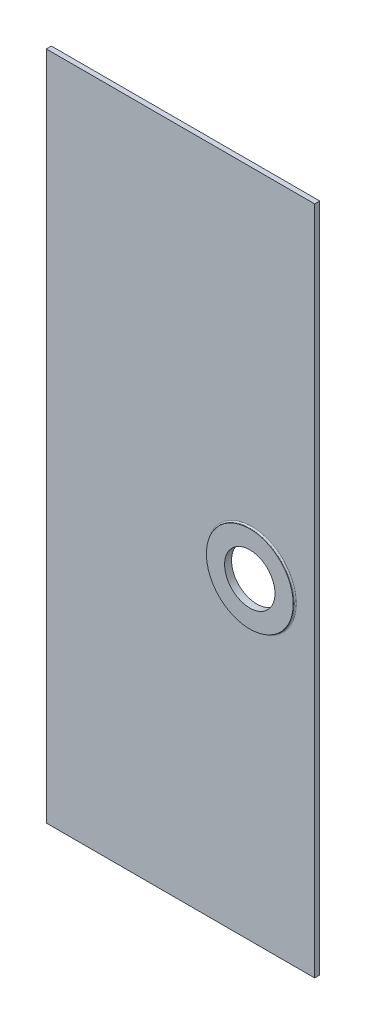
ISO-10303-21;
HEADER;
FILE_DESCRIPTION(('STEP AP214'),'2;1');
FILE_NAME('part.step','',(''),(''),'','','');
FILE_SCHEMA(('AUTOMOTIVE_DESIGN { 1 0 10303 214 1 1 1 1 }'));
ENDSEC;
DATA;
#1=APPLICATION_CONTEXT('core data for automotive mechanical design processes');
#2=APPLICATION_PROTOCOL_DEFINITION('international standard','automotive_design',2000,#1);
#3=PRODUCT_CONTEXT('',#1,'mechanical');
#4=PRODUCT('Part','Part','',(#3));
#5=PRODUCT_RELATED_PRODUCT_CATEGORY('part','',(#4));
#6=PRODUCT_DEFINITION_FORMATION('','',#4);
#7=PRODUCT_DEFINITION_CONTEXT('part definition',#1,'design');
#8=PRODUCT_DEFINITION('design','',#6,#7);
#9=PRODUCT_DEFINITION_SHAPE('','',#8);
#10=(LENGTH_UNIT() NAMED_UNIT(*) SI_UNIT(.MILLI.,.METRE.));
#11=(NAMED_UNIT(*) PLANE_ANGLE_UNIT() SI_UNIT($,.RADIAN.));
#12=(NAMED_UNIT(*) SI_UNIT($,.STERADIAN.) SOLID_ANGLE_UNIT());
#13=UNCERTAINTY_MEASURE_WITH_UNIT(LENGTH_MEASURE(1.E-05),#10,'distance_accuracy_value','');
#14=(GEOMETRIC_REPRESENTATION_CONTEXT(3) GLOBAL_UNCERTAINTY_ASSIGNED_CONTEXT((#13)) GLOBAL_UNIT_ASSIGNED_CONTEXT((#10,
#11,#12)) REPRESENTATION_CONTEXT('',''));
#15=CARTESIAN_POINT('',(0.,0.,0.));
#16=DIRECTION('',(0.,0.,1.));
#17=DIRECTION('',(1.,0.,0.));
#18=AXIS2_PLACEMENT_3D('',#15,#16,#17);
#19=CARTESIAN_POINT('',(0.,0.,2.));
#20=DIRECTION('',(1.,0.,0.));
#21=DIRECTION('',(0.,0.,-1.));
#22=AXIS2_PLACEMENT_3D('',#19,#20,#21);
#23=PLANE('',#22);
#24=DIRECTION('',(0.,-1.,0.));
#25=VECTOR('',#24,1.);
#26=CARTESIAN_POINT('',(0.,0.,0.));
#27=LINE('',#26,#25);
#28=CARTESIAN_POINT('',(0.,0.,0.));
#29=VERTEX_POINT('',#28);
#30=CARTESIAN_POINT('',(0.,-266.,0.));
#31=VERTEX_POINT('',#30);
#32=EDGE_CURVE('E102',#29,#31,#27,.T.);
#33=ORIENTED_EDGE('',*,*,#32,.T.);
#34=DIRECTION('',(0.,0.,-1.));
#35=VECTOR('',#34,1.);
#36=CARTESIAN_POINT('',(0.,-266.,2.));
#37=LINE('',#36,#35);
#38=CARTESIAN_POINT('',(0.,-266.,2.));
#39=VERTEX_POINT('',#38);
#40=EDGE_CURVE('E93',#39,#31,#37,.T.);
#41=ORIENTED_EDGE('',*,*,#40,.F.);
#42=DIRECTION('',(0.,-1.,0.));
#43=VECTOR('',#42,1.);
#44=CARTESIAN_POINT('',(0.,0.,2.));
#45=LINE('',#44,#43);
#46=CARTESIAN_POINT('',(0.,0.,2.));
#47=VERTEX_POINT('',#46);
#48=EDGE_CURVE('E87',#47,#39,#45,.T.);
#49=ORIENTED_EDGE('',*,*,#48,.F.);
#50=DIRECTION('',(0.,0.,-1.));
#51=VECTOR('',#50,1.);
#52=CARTESIAN_POINT('',(0.,0.,2.));
#53=LINE('',#52,#51);
#54=EDGE_CURVE('E98',#47,#29,#53,.T.);
#55=ORIENTED_EDGE('',*,*,#54,.T.);
#56=EDGE_LOOP('',(#33,#41,#49,#55));
#57=FACE_BOUND('',#56,.T.);
#58=ADVANCED_FACE('F34',(#57),#23,.F.);
#59=CARTESIAN_POINT('',(0.,-266.,2.));
#60=DIRECTION('',(0.,1.,0.));
#61=DIRECTION('',(0.,0.,1.));
#62=AXIS2_PLACEMENT_3D('',#59,#60,#61);
#63=PLANE('',#62);
#64=DIRECTION('',(1.,0.,0.));
#65=VECTOR('',#64,1.);
#66=CARTESIAN_POINT('',(0.,-266.,0.));
#67=LINE('',#66,#65);
#68=CARTESIAN_POINT('',(106.5,-266.,0.));
#69=VERTEX_POINT('',#68);
#70=EDGE_CURVE('E92',#31,#69,#67,.T.);
#71=ORIENTED_EDGE('',*,*,#70,.T.);
#72=DIRECTION('',(0.,0.,-1.));
#73=VECTOR('',#72,1.);
#74=CARTESIAN_POINT('',(106.5,-266.,2.));
#75=LINE('',#74,#73);
#76=CARTESIAN_POINT('',(106.5,-266.,2.));
#77=VERTEX_POINT('',#76);
#78=EDGE_CURVE('E90',#77,#69,#75,.T.);
#79=ORIENTED_EDGE('',*,*,#78,.F.);
#80=DIRECTION('',(1.,0.,0.));
#81=VECTOR('',#80,1.);
#82=CARTESIAN_POINT('',(0.,-266.,2.));
#83=LINE('',#82,#81);
#84=EDGE_CURVE('E82',#39,#77,#83,.T.);
#85=ORIENTED_EDGE('',*,*,#84,.F.);
#86=ORIENTED_EDGE('',*,*,#40,.T.);
#87=EDGE_LOOP('',(#71,#79,#85,#86));
#88=FACE_BOUND('',#87,.T.);
#89=ADVANCED_FACE('F91',(#88),#63,.F.);
#90=CARTESIAN_POINT('',(106.5,0.,2.));
#91=DIRECTION('',(-1.,0.,0.));
#92=DIRECTION('',(0.,-1.,0.));
#93=AXIS2_PLACEMENT_3D('',#90,#91,#92);
#94=PLANE('',#93);
#95=DIRECTION('',(0.,1.,0.));
#96=VECTOR('',#95,1.);
#97=CARTESIAN_POINT('',(106.5,0.,0.));
#98=LINE('',#97,#96);
#99=CARTESIAN_POINT('',(106.5,0.,0.));
#100=VERTEX_POINT('',#99);
#101=EDGE_CURVE('E68',#69,#100,#98,.T.);
#102=ORIENTED_EDGE('',*,*,#101,.T.);
#103=DIRECTION('',(0.,0.,-1.));
#104=VECTOR('',#103,1.);
#105=CARTESIAN_POINT('',(106.5,0.,2.));
#106=LINE('',#105,#104);
#107=CARTESIAN_POINT('',(106.5,0.,2.));
#108=VERTEX_POINT('',#107);
#109=EDGE_CURVE('E94',#108,#100,#106,.T.);
#110=ORIENTED_EDGE('',*,*,#109,.F.);
#111=DIRECTION('',(0.,1.,0.));
#112=VECTOR('',#111,1.);
#113=CARTESIAN_POINT('',(106.5,0.,2.));
#114=LINE('',#113,#112);
#115=EDGE_CURVE('E85',#77,#108,#114,.T.);
#116=ORIENTED_EDGE('',*,*,#115,.F.);
#117=ORIENTED_EDGE('',*,*,#78,.T.);
#118=EDGE_LOOP('',(#102,#110,#116,#117));
#119=FACE_BOUND('',#118,.T.);
#120=ADVANCED_FACE('F96',(#119),#94,.F.);
#121=CARTESIAN_POINT('',(0.,0.,2.));
#122=DIRECTION('',(0.,-1.,0.));
#123=DIRECTION('',(0.,0.,-1.));
#124=AXIS2_PLACEMENT_3D('',#121,#122,#123);
#125=PLANE('',#124);
#126=DIRECTION('',(-1.,0.,0.));
#127=VECTOR('',#126,1.);
#128=CARTESIAN_POINT('',(0.,0.,0.));
#129=LINE('',#128,#127);
#130=EDGE_CURVE('E74',#100,#29,#129,.T.);
#131=ORIENTED_EDGE('',*,*,#130,.T.);
#132=ORIENTED_EDGE('',*,*,#54,.F.);
#133=DIRECTION('',(-1.,0.,0.));
#134=VECTOR('',#133,1.);
#135=CARTESIAN_POINT('',(0.,0.,2.));
#136=LINE('',#135,#134);
#137=EDGE_CURVE('E51',#108,#47,#136,.T.);
#138=ORIENTED_EDGE('',*,*,#137,.F.);
#139=ORIENTED_EDGE('',*,*,#109,.T.);
#140=EDGE_LOOP('',(#131,#132,#138,#139));
#141=FACE_BOUND('',#140,.T.);
#142=ADVANCED_FACE('F138',(#141),#125,.F.);
#143=CARTESIAN_POINT('',(0.,0.,2.));
#144=DIRECTION('',(0.,0.,1.));
#145=DIRECTION('',(1.,0.,0.));
#146=AXIS2_PLACEMENT_3D('',#143,#144,#145);
#147=PLANE('',#146);
#148=CARTESIAN_POINT('',(81.5,-141.,2.));
#149=DIRECTION('',(0.,0.,1.));
#150=DIRECTION('',(1.,0.,0.));
#151=AXIS2_PLACEMENT_3D('',#148,#149,#150);
#152=CIRCLE('',#151,17.7213517355088);
#153=CARTESIAN_POINT('',(99.2213517355088,-141.,2.));
#154=VERTEX_POINT('',#153);
#155=EDGE_CURVE('E11',#154,#154,#152,.F.);
#156=ORIENTED_EDGE('',*,*,#155,.T.);
#157=EDGE_LOOP('',(#156));
#158=FACE_BOUND('',#157,.T.);
#159=ORIENTED_EDGE('',*,*,#48,.T.);
#160=ORIENTED_EDGE('',*,*,#84,.T.);
#161=ORIENTED_EDGE('',*,*,#115,.T.);
#162=ORIENTED_EDGE('',*,*,#137,.T.);
#163=EDGE_LOOP('',(#159,#160,#161,#162));
#164=FACE_BOUND('',#163,.T.);
#165=ADVANCED_FACE('F83',(#158,#164),#147,.T.);
#166=CARTESIAN_POINT('',(0.,0.,0.));
#167=DIRECTION('',(0.,0.,1.));
#168=DIRECTION('',(1.,0.,0.));
#169=AXIS2_PLACEMENT_3D('',#166,#167,#168);
#170=PLANE('',#169);
#171=CARTESIAN_POINT('',(81.5,-141.,0.));
#172=DIRECTION('',(0.,0.,1.));
#173=DIRECTION('',(1.,0.,0.));
#174=AXIS2_PLACEMENT_3D('',#171,#172,#173);
#175=CIRCLE('',#174,10.);
#176=CARTESIAN_POINT('',(91.5,-141.,0.));
#177=VERTEX_POINT('',#176);
#178=EDGE_CURVE('E105',#177,#177,#175,.T.);
#179=ORIENTED_EDGE('',*,*,#178,.T.);
#180=EDGE_LOOP('',(#179));
#181=FACE_BOUND('',#180,.T.);
#182=ORIENTED_EDGE('',*,*,#32,.F.);
#183=ORIENTED_EDGE('',*,*,#130,.F.);
#184=ORIENTED_EDGE('',*,*,#101,.F.);
#185=ORIENTED_EDGE('',*,*,#70,.F.);
#186=EDGE_LOOP('',(#182,#183,#184,#185));
#187=FACE_BOUND('',#186,.T.);
#188=ADVANCED_FACE('F141',(#181,#187),#170,.F.);
#189=CARTESIAN_POINT('',(81.5,-141.,-8.));
#190=DIRECTION('',(0.,0.,1.));
#191=DIRECTION('',(1.,0.,0.));
#192=AXIS2_PLACEMENT_3D('',#189,#190,#191);
#193=CYLINDRICAL_SURFACE('',#192,10.);
#194=ORIENTED_EDGE('',*,*,#178,.F.);
#195=EDGE_LOOP('',(#194));
#196=FACE_BOUND('',#195,.T.);
#197=CARTESIAN_POINT('',(81.5,-141.,2.75));
#198=DIRECTION('',(0.,0.,-1.));
#199=DIRECTION('',(-1.,0.,0.));
#200=AXIS2_PLACEMENT_3D('',#197,#198,#199);
#201=CIRCLE('',#200,10.);
#202=CARTESIAN_POINT('',(71.5,-141.,2.75));
#203=VERTEX_POINT('',#202);
#204=EDGE_CURVE('E216',#203,#203,#201,.T.);
#205=ORIENTED_EDGE('',*,*,#204,.F.);
#206=EDGE_LOOP('',(#205));
#207=FACE_BOUND('',#206,.T.);
#208=ADVANCED_FACE('F144',(#196,#207),#193,.F.);
#209=CARTESIAN_POINT('',(81.5,-141.,2.75));
#210=DIRECTION('',(0.,0.,-1.));
#211=DIRECTION('',(-1.,0.,0.));
#212=AXIS2_PLACEMENT_3D('',#209,#210,#211);
#213=CYLINDRICAL_SURFACE('',#212,17.2213517355088);
#214=CARTESIAN_POINT('',(81.5,-141.,2.5));
#215=DIRECTION('',(0.,0.,1.));
#216=DIRECTION('',(1.,0.,0.));
#217=AXIS2_PLACEMENT_3D('',#214,#215,#216);
#218=CIRCLE('',#217,17.2213517355088);
#219=CARTESIAN_POINT('',(98.7213517355088,-141.,2.5));
#220=VERTEX_POINT('',#219);
#221=EDGE_CURVE('E43',#220,#220,#218,.T.);
#222=ORIENTED_EDGE('',*,*,#221,.T.);
#223=EDGE_LOOP('',(#222));
#224=FACE_BOUND('',#223,.T.);
#225=CARTESIAN_POINT('',(81.5,-141.,2.75));
#226=DIRECTION('',(0.,0.,1.));
#227=DIRECTION('',(1.,0.,0.));
#228=AXIS2_PLACEMENT_3D('',#225,#226,#227);
#229=CIRCLE('',#228,17.2213517355088);
#230=CARTESIAN_POINT('',(98.7213517355088,-141.,2.75));
#231=VERTEX_POINT('',#230);
#232=EDGE_CURVE('E113',#231,#231,#229,.T.);
#233=ORIENTED_EDGE('',*,*,#232,.F.);
#234=EDGE_LOOP('',(#233));
#235=FACE_BOUND('',#234,.T.);
#236=ADVANCED_FACE('F117',(#224,#235),#213,.T.);
#237=CARTESIAN_POINT('',(81.5,-141.,2.75));
#238=DIRECTION('',(0.,0.,1.));
#239=DIRECTION('',(1.,0.,0.));
#240=AXIS2_PLACEMENT_3D('',#237,#238,#239);
#241=PLANE('',#240);
#242=ORIENTED_EDGE('',*,*,#204,.T.);
#243=EDGE_LOOP('',(#242));
#244=FACE_BOUND('',#243,.T.);
#245=ORIENTED_EDGE('',*,*,#232,.T.);
#246=EDGE_LOOP('',(#245));
#247=FACE_BOUND('',#246,.T.);
#248=ADVANCED_FACE('F121',(#244,#247),#241,.T.);
#249=CARTESIAN_POINT('',(81.5,-141.,2.5));
#250=DIRECTION('',(0.,0.,1.));
#251=DIRECTION('',(1.,0.,0.));
#252=AXIS2_PLACEMENT_3D('',#249,#250,#251);
#253=TOROIDAL_SURFACE('',#252,17.7213517355088,0.5);
#254=ORIENTED_EDGE('',*,*,#155,.F.);
#255=EDGE_LOOP('',(#254));
#256=FACE_BOUND('',#255,.T.);
#257=ORIENTED_EDGE('',*,*,#221,.F.);
#258=EDGE_LOOP('',(#257));
#259=FACE_BOUND('',#258,.T.);
#260=ADVANCED_FACE('F36',(#256,#259),#253,.F.);
#261=CLOSED_SHELL('',(#58,#89,#120,#142,#165,#188,#208,#236,#248,#260));
#262=MANIFOLD_SOLID_BREP('B2',#261);
#263=ADVANCED_BREP_SHAPE_REPRESENTATION('',(#18,#262),#14);
#264=SHAPE_DEFINITION_REPRESENTATION(#9,#263);
ENDSEC;
END-ISO-10303-21;
